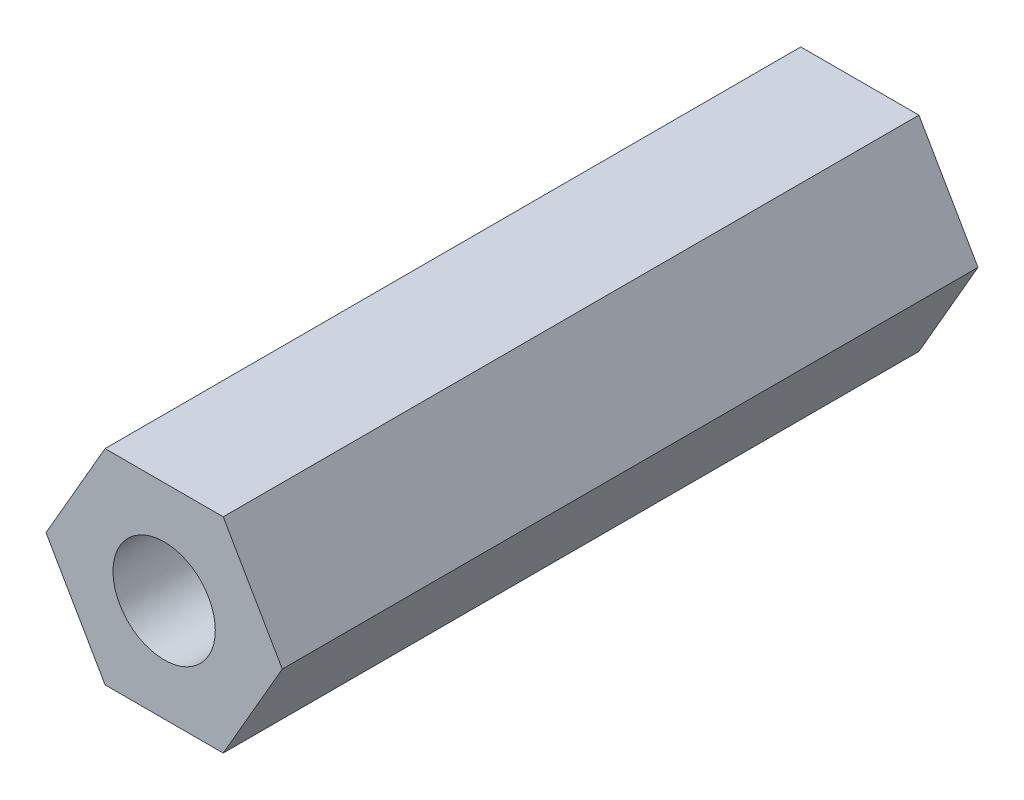
ISO-10303-21;
HEADER;
FILE_DESCRIPTION(('STEP AP214'),'2;1');
FILE_NAME('part.step','',(''),(''),'','','');
FILE_SCHEMA(('AUTOMOTIVE_DESIGN { 1 0 10303 214 1 1 1 1 }'));
ENDSEC;
DATA;
#1=APPLICATION_CONTEXT('core data for automotive mechanical design processes');
#2=APPLICATION_PROTOCOL_DEFINITION('international standard','automotive_design',2000,#1);
#3=PRODUCT_CONTEXT('',#1,'mechanical');
#4=PRODUCT('Part','Part','',(#3));
#5=PRODUCT_RELATED_PRODUCT_CATEGORY('part','',(#4));
#6=PRODUCT_DEFINITION_FORMATION('','',#4);
#7=PRODUCT_DEFINITION_CONTEXT('part definition',#1,'design');
#8=PRODUCT_DEFINITION('design','',#6,#7);
#9=PRODUCT_DEFINITION_SHAPE('','',#8);
#10=(LENGTH_UNIT() NAMED_UNIT(*) SI_UNIT(.MILLI.,.METRE.));
#11=(NAMED_UNIT(*) PLANE_ANGLE_UNIT() SI_UNIT($,.RADIAN.));
#12=(NAMED_UNIT(*) SI_UNIT($,.STERADIAN.) SOLID_ANGLE_UNIT());
#13=UNCERTAINTY_MEASURE_WITH_UNIT(LENGTH_MEASURE(1.E-05),#10,'distance_accuracy_value','');
#14=(GEOMETRIC_REPRESENTATION_CONTEXT(3) GLOBAL_UNCERTAINTY_ASSIGNED_CONTEXT((#13)) GLOBAL_UNIT_ASSIGNED_CONTEXT((#10,
#11,#12)) REPRESENTATION_CONTEXT('',''));
#15=CARTESIAN_POINT('',(0.,0.,0.));
#16=DIRECTION('',(0.,0.,1.));
#17=DIRECTION('',(1.,0.,0.));
#18=AXIS2_PLACEMENT_3D('',#15,#16,#17);
#19=CARTESIAN_POINT('',(0.,0.,43.18));
#20=DIRECTION('',(0.,0.,1.));
#21=DIRECTION('',(1.,0.,0.));
#22=AXIS2_PLACEMENT_3D('',#19,#20,#21);
#23=PLANE('',#22);
#24=DIRECTION('',(0.499999999999995,0.866025403784441,0.));
#25=VECTOR('',#24,1.);
#26=CARTESIAN_POINT('',(3.66617420935418,-6.34999999999993,43.18));
#27=LINE('',#26,#25);
#28=CARTESIAN_POINT('',(3.66617420935418,-6.34999999999993,43.18));
#29=VERTEX_POINT('',#28);
#30=CARTESIAN_POINT('',(7.33234841870821,0.,43.18));
#31=VERTEX_POINT('',#30);
#32=EDGE_CURVE('E152',#29,#31,#27,.T.);
#33=ORIENTED_EDGE('',*,*,#32,.T.);
#34=DIRECTION('',(-0.500000000000001,0.866025403784438,0.));
#35=VECTOR('',#34,1.);
#36=CARTESIAN_POINT('',(7.33234841870821,0.,43.18));
#37=LINE('',#36,#35);
#38=CARTESIAN_POINT('',(3.66617420935409,6.34999999999998,43.18));
#39=VERTEX_POINT('',#38);
#40=EDGE_CURVE('E100',#31,#39,#37,.T.);
#41=ORIENTED_EDGE('',*,*,#40,.T.);
#42=DIRECTION('',(-1.,0.,0.));
#43=VECTOR('',#42,1.);
#44=CARTESIAN_POINT('',(3.66617420935409,6.34999999999998,43.18));
#45=LINE('',#44,#43);
#46=CARTESIAN_POINT('',(-3.66617420935413,6.34999999999995,43.18));
#47=VERTEX_POINT('',#46);
#48=EDGE_CURVE('E113',#39,#47,#45,.T.);
#49=ORIENTED_EDGE('',*,*,#48,.T.);
#50=DIRECTION('',(-0.499999999999995,-0.866025403784442,0.));
#51=VECTOR('',#50,1.);
#52=CARTESIAN_POINT('',(-3.66617420935413,6.34999999999995,43.18));
#53=LINE('',#52,#51);
#54=CARTESIAN_POINT('',(-7.33234841870821,0.,43.18));
#55=VERTEX_POINT('',#54);
#56=EDGE_CURVE('E107',#47,#55,#53,.T.);
#57=ORIENTED_EDGE('',*,*,#56,.T.);
#58=DIRECTION('',(0.500000000000007,-0.866025403784434,0.));
#59=VECTOR('',#58,1.);
#60=CARTESIAN_POINT('',(-7.33234841870821,0.,43.18));
#61=LINE('',#60,#59);
#62=CARTESIAN_POINT('',(-3.66617420935405,-6.35,43.18));
#63=VERTEX_POINT('',#62);
#64=EDGE_CURVE('E111',#55,#63,#61,.T.);
#65=ORIENTED_EDGE('',*,*,#64,.T.);
#66=DIRECTION('',(1.,0.,0.));
#67=VECTOR('',#66,1.);
#68=CARTESIAN_POINT('',(-3.66617420935405,-6.35,43.18));
#69=LINE('',#68,#67);
#70=EDGE_CURVE('E63',#63,#29,#69,.T.);
#71=ORIENTED_EDGE('',*,*,#70,.T.);
#72=EDGE_LOOP('',(#33,#41,#49,#57,#65,#71));
#73=FACE_BOUND('',#72,.T.);
#74=CARTESIAN_POINT('',(0.,0.,43.18));
#75=DIRECTION('',(0.,0.,1.));
#76=DIRECTION('',(1.,0.,0.));
#77=AXIS2_PLACEMENT_3D('',#74,#75,#76);
#78=CIRCLE('',#77,3.175);
#79=CARTESIAN_POINT('',(3.175,0.,43.18));
#80=VERTEX_POINT('',#79);
#81=EDGE_CURVE('E140',#80,#80,#78,.T.);
#82=ORIENTED_EDGE('',*,*,#81,.F.);
#83=EDGE_LOOP('',(#82));
#84=FACE_BOUND('',#83,.T.);
#85=ADVANCED_FACE('F45',(#73,#84),#23,.T.);
#86=CARTESIAN_POINT('',(0.,0.,0.));
#87=DIRECTION('',(0.,0.,1.));
#88=DIRECTION('',(1.,0.,0.));
#89=AXIS2_PLACEMENT_3D('',#86,#87,#88);
#90=PLANE('',#89);
#91=DIRECTION('',(0.499999999999995,0.866025403784441,0.));
#92=VECTOR('',#91,1.);
#93=CARTESIAN_POINT('',(3.66617420935418,-6.34999999999993,0.));
#94=LINE('',#93,#92);
#95=CARTESIAN_POINT('',(3.66617420935418,-6.34999999999993,0.));
#96=VERTEX_POINT('',#95);
#97=CARTESIAN_POINT('',(7.33234841870821,0.,0.));
#98=VERTEX_POINT('',#97);
#99=EDGE_CURVE('E135',#96,#98,#94,.T.);
#100=ORIENTED_EDGE('',*,*,#99,.F.);
#101=DIRECTION('',(1.,0.,0.));
#102=VECTOR('',#101,1.);
#103=CARTESIAN_POINT('',(-3.66617420935405,-6.35,0.));
#104=LINE('',#103,#102);
#105=CARTESIAN_POINT('',(-3.66617420935405,-6.35,0.));
#106=VERTEX_POINT('',#105);
#107=EDGE_CURVE('E92',#106,#96,#104,.T.);
#108=ORIENTED_EDGE('',*,*,#107,.F.);
#109=DIRECTION('',(0.500000000000007,-0.866025403784434,0.));
#110=VECTOR('',#109,1.);
#111=CARTESIAN_POINT('',(-7.33234841870821,0.,0.));
#112=LINE('',#111,#110);
#113=CARTESIAN_POINT('',(-7.33234841870821,0.,0.));
#114=VERTEX_POINT('',#113);
#115=EDGE_CURVE('E86',#114,#106,#112,.T.);
#116=ORIENTED_EDGE('',*,*,#115,.F.);
#117=DIRECTION('',(-0.499999999999995,-0.866025403784442,0.));
#118=VECTOR('',#117,1.);
#119=CARTESIAN_POINT('',(-3.66617420935413,6.34999999999995,0.));
#120=LINE('',#119,#118);
#121=CARTESIAN_POINT('',(-3.66617420935413,6.34999999999995,0.));
#122=VERTEX_POINT('',#121);
#123=EDGE_CURVE('E122',#122,#114,#120,.T.);
#124=ORIENTED_EDGE('',*,*,#123,.F.);
#125=DIRECTION('',(-1.,0.,0.));
#126=VECTOR('',#125,1.);
#127=CARTESIAN_POINT('',(3.66617420935409,6.34999999999998,0.));
#128=LINE('',#127,#126);
#129=CARTESIAN_POINT('',(3.66617420935409,6.34999999999998,0.));
#130=VERTEX_POINT('',#129);
#131=EDGE_CURVE('E143',#130,#122,#128,.T.);
#132=ORIENTED_EDGE('',*,*,#131,.F.);
#133=DIRECTION('',(-0.500000000000001,0.866025403784438,0.));
#134=VECTOR('',#133,1.);
#135=CARTESIAN_POINT('',(7.33234841870821,0.,0.));
#136=LINE('',#135,#134);
#137=EDGE_CURVE('E139',#98,#130,#136,.T.);
#138=ORIENTED_EDGE('',*,*,#137,.F.);
#139=EDGE_LOOP('',(#100,#108,#116,#124,#132,#138));
#140=FACE_BOUND('',#139,.T.);
#141=CARTESIAN_POINT('',(0.,0.,0.));
#142=DIRECTION('',(0.,0.,1.));
#143=DIRECTION('',(1.,0.,0.));
#144=AXIS2_PLACEMENT_3D('',#141,#142,#143);
#145=CIRCLE('',#144,3.175);
#146=CARTESIAN_POINT('',(3.175,0.,0.));
#147=VERTEX_POINT('',#146);
#148=EDGE_CURVE('E249',#147,#147,#145,.T.);
#149=ORIENTED_EDGE('',*,*,#148,.T.);
#150=EDGE_LOOP('',(#149));
#151=FACE_BOUND('',#150,.T.);
#152=ADVANCED_FACE('F165',(#140,#151),#90,.F.);
#153=CARTESIAN_POINT('',(3.66617420935418,-6.34999999999993,43.18));
#154=DIRECTION('',(-0.866025403784441,0.499999999999995,0.));
#155=DIRECTION('',(-0.499999999999995,-0.866025403784441,0.));
#156=AXIS2_PLACEMENT_3D('',#153,#154,#155);
#157=PLANE('',#156);
#158=ORIENTED_EDGE('',*,*,#99,.T.);
#159=DIRECTION('',(0.,0.,-1.));
#160=VECTOR('',#159,1.);
#161=CARTESIAN_POINT('',(7.33234841870821,0.,43.18));
#162=LINE('',#161,#160);
#163=EDGE_CURVE('E11',#31,#98,#162,.T.);
#164=ORIENTED_EDGE('',*,*,#163,.F.);
#165=ORIENTED_EDGE('',*,*,#32,.F.);
#166=DIRECTION('',(0.,0.,-1.));
#167=VECTOR('',#166,1.);
#168=CARTESIAN_POINT('',(3.66617420935418,-6.34999999999993,43.18));
#169=LINE('',#168,#167);
#170=EDGE_CURVE('E131',#29,#96,#169,.T.);
#171=ORIENTED_EDGE('',*,*,#170,.T.);
#172=EDGE_LOOP('',(#158,#164,#165,#171));
#173=FACE_BOUND('',#172,.T.);
#174=ADVANCED_FACE('F47',(#173),#157,.F.);
#175=CARTESIAN_POINT('',(7.33234841870821,0.,43.18));
#176=DIRECTION('',(-0.866025403784438,-0.500000000000001,0.));
#177=DIRECTION('',(0.500000000000001,-0.866025403784438,0.));
#178=AXIS2_PLACEMENT_3D('',#175,#176,#177);
#179=PLANE('',#178);
#180=ORIENTED_EDGE('',*,*,#137,.T.);
#181=DIRECTION('',(0.,0.,-1.));
#182=VECTOR('',#181,1.);
#183=CARTESIAN_POINT('',(3.66617420935409,6.34999999999998,43.18));
#184=LINE('',#183,#182);
#185=EDGE_CURVE('E55',#39,#130,#184,.T.);
#186=ORIENTED_EDGE('',*,*,#185,.F.);
#187=ORIENTED_EDGE('',*,*,#40,.F.);
#188=ORIENTED_EDGE('',*,*,#163,.T.);
#189=EDGE_LOOP('',(#180,#186,#187,#188));
#190=FACE_BOUND('',#189,.T.);
#191=ADVANCED_FACE('F190',(#190),#179,.F.);
#192=CARTESIAN_POINT('',(3.66617420935409,6.34999999999998,43.18));
#193=DIRECTION('',(0.,-1.,0.));
#194=DIRECTION('',(1.,0.,0.));
#195=AXIS2_PLACEMENT_3D('',#192,#193,#194);
#196=PLANE('',#195);
#197=ORIENTED_EDGE('',*,*,#131,.T.);
#198=DIRECTION('',(0.,0.,-1.));
#199=VECTOR('',#198,1.);
#200=CARTESIAN_POINT('',(-3.66617420935413,6.34999999999995,43.18));
#201=LINE('',#200,#199);
#202=EDGE_CURVE('E124',#47,#122,#201,.T.);
#203=ORIENTED_EDGE('',*,*,#202,.F.);
#204=ORIENTED_EDGE('',*,*,#48,.F.);
#205=ORIENTED_EDGE('',*,*,#185,.T.);
#206=EDGE_LOOP('',(#197,#203,#204,#205));
#207=FACE_BOUND('',#206,.T.);
#208=ADVANCED_FACE('F162',(#207),#196,.F.);
#209=CARTESIAN_POINT('',(-3.66617420935413,6.34999999999995,43.18));
#210=DIRECTION('',(0.866025403784442,-0.499999999999995,0.));
#211=DIRECTION('',(0.499999999999995,0.866025403784442,0.));
#212=AXIS2_PLACEMENT_3D('',#209,#210,#211);
#213=PLANE('',#212);
#214=ORIENTED_EDGE('',*,*,#123,.T.);
#215=DIRECTION('',(0.,0.,-1.));
#216=VECTOR('',#215,1.);
#217=CARTESIAN_POINT('',(-7.33234841870821,0.,43.18));
#218=LINE('',#217,#216);
#219=EDGE_CURVE('E119',#55,#114,#218,.T.);
#220=ORIENTED_EDGE('',*,*,#219,.F.);
#221=ORIENTED_EDGE('',*,*,#56,.F.);
#222=ORIENTED_EDGE('',*,*,#202,.T.);
#223=EDGE_LOOP('',(#214,#220,#221,#222));
#224=FACE_BOUND('',#223,.T.);
#225=ADVANCED_FACE('F120',(#224),#213,.F.);
#226=CARTESIAN_POINT('',(-7.33234841870821,0.,43.18));
#227=DIRECTION('',(0.866025403784435,0.500000000000007,0.));
#228=DIRECTION('',(-0.500000000000007,0.866025403784435,0.));
#229=AXIS2_PLACEMENT_3D('',#226,#227,#228);
#230=PLANE('',#229);
#231=ORIENTED_EDGE('',*,*,#115,.T.);
#232=DIRECTION('',(0.,0.,-1.));
#233=VECTOR('',#232,1.);
#234=CARTESIAN_POINT('',(-3.66617420935405,-6.35,43.18));
#235=LINE('',#234,#233);
#236=EDGE_CURVE('E125',#63,#106,#235,.T.);
#237=ORIENTED_EDGE('',*,*,#236,.F.);
#238=ORIENTED_EDGE('',*,*,#64,.F.);
#239=ORIENTED_EDGE('',*,*,#219,.T.);
#240=EDGE_LOOP('',(#231,#237,#238,#239));
#241=FACE_BOUND('',#240,.T.);
#242=ADVANCED_FACE('F127',(#241),#230,.F.);
#243=CARTESIAN_POINT('',(-3.66617420935405,-6.35,43.18));
#244=DIRECTION('',(0.,1.,0.));
#245=DIRECTION('',(-1.,0.,0.));
#246=AXIS2_PLACEMENT_3D('',#243,#244,#245);
#247=PLANE('',#246);
#248=ORIENTED_EDGE('',*,*,#107,.T.);
#249=ORIENTED_EDGE('',*,*,#170,.F.);
#250=ORIENTED_EDGE('',*,*,#70,.F.);
#251=ORIENTED_EDGE('',*,*,#236,.T.);
#252=EDGE_LOOP('',(#248,#249,#250,#251));
#253=FACE_BOUND('',#252,.T.);
#254=ADVANCED_FACE('F170',(#253),#247,.F.);
#255=CARTESIAN_POINT('',(0.,0.,43.18));
#256=DIRECTION('',(0.,0.,-1.));
#257=DIRECTION('',(-1.,0.,0.));
#258=AXIS2_PLACEMENT_3D('',#255,#256,#257);
#259=CYLINDRICAL_SURFACE('',#258,3.175);
#260=ORIENTED_EDGE('',*,*,#81,.T.);
#261=EDGE_LOOP('',(#260));
#262=FACE_BOUND('',#261,.T.);
#263=ORIENTED_EDGE('',*,*,#148,.F.);
#264=EDGE_LOOP('',(#263));
#265=FACE_BOUND('',#264,.T.);
#266=ADVANCED_FACE('F172',(#262,#265),#259,.F.);
#267=CLOSED_SHELL('',(#85,#152,#174,#191,#208,#225,#242,#254,#266));
#268=MANIFOLD_SOLID_BREP('B2',#267);
#269=ADVANCED_BREP_SHAPE_REPRESENTATION('',(#18,#268),#14);
#270=SHAPE_DEFINITION_REPRESENTATION(#9,#269);
ENDSEC;
END-ISO-10303-21;
